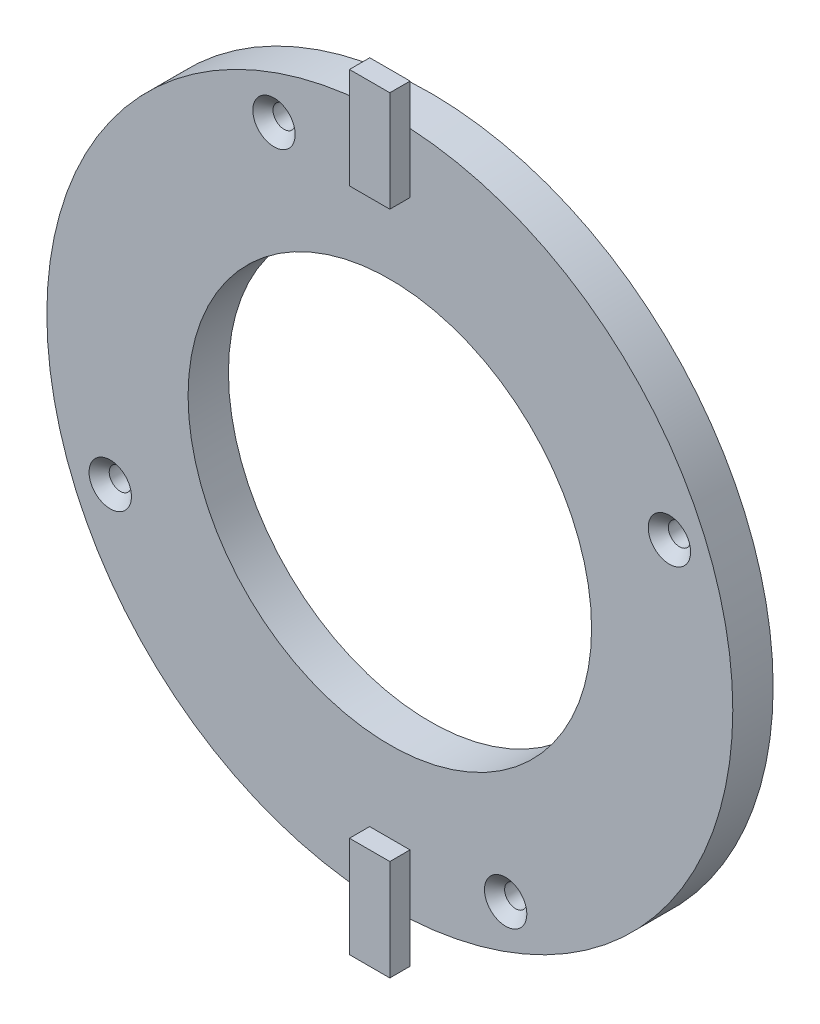
ISO-10303-21;
HEADER;
FILE_DESCRIPTION(('STEP AP214'),'2;1');
FILE_NAME('part.step','',(''),(''),'','','');
FILE_SCHEMA(('AUTOMOTIVE_DESIGN { 1 0 10303 214 1 1 1 1 }'));
ENDSEC;
DATA;
#1=APPLICATION_CONTEXT('core data for automotive mechanical design processes');
#2=APPLICATION_PROTOCOL_DEFINITION('international standard','automotive_design',2000,#1);
#3=PRODUCT_CONTEXT('',#1,'mechanical');
#4=PRODUCT('Part','Part','',(#3));
#5=PRODUCT_RELATED_PRODUCT_CATEGORY('part','',(#4));
#6=PRODUCT_DEFINITION_FORMATION('','',#4);
#7=PRODUCT_DEFINITION_CONTEXT('part definition',#1,'design');
#8=PRODUCT_DEFINITION('design','',#6,#7);
#9=PRODUCT_DEFINITION_SHAPE('','',#8);
#10=(LENGTH_UNIT() NAMED_UNIT(*) SI_UNIT(.MILLI.,.METRE.));
#11=(NAMED_UNIT(*) PLANE_ANGLE_UNIT() SI_UNIT($,.RADIAN.));
#12=(NAMED_UNIT(*) SI_UNIT($,.STERADIAN.) SOLID_ANGLE_UNIT());
#13=UNCERTAINTY_MEASURE_WITH_UNIT(LENGTH_MEASURE(1.E-05),#10,'distance_accuracy_value','');
#14=(GEOMETRIC_REPRESENTATION_CONTEXT(3) GLOBAL_UNCERTAINTY_ASSIGNED_CONTEXT((#13)) GLOBAL_UNIT_ASSIGNED_CONTEXT((#10,
#11,#12)) REPRESENTATION_CONTEXT('',''));
#15=CARTESIAN_POINT('',(0.,0.,0.));
#16=DIRECTION('',(0.,0.,1.));
#17=DIRECTION('',(1.,0.,0.));
#18=AXIS2_PLACEMENT_3D('',#15,#16,#17);
#19=CARTESIAN_POINT('',(11.4805029709527,-27.7163859753386,-0.00999999999999959));
#20=DIRECTION('',(0.,0.,1.));
#21=DIRECTION('',(1.,0.,0.));
#22=AXIS2_PLACEMENT_3D('',#19,#20,#21);
#23=CYLINDRICAL_SURFACE('',#22,1.1);
#24=CARTESIAN_POINT('',(11.4805029709527,-27.7163859753386,3.));
#25=DIRECTION('',(0.,0.,1.));
#26=DIRECTION('',(1.,0.,0.));
#27=AXIS2_PLACEMENT_3D('',#24,#25,#26);
#28=CIRCLE('',#27,1.1);
#29=CARTESIAN_POINT('',(12.5805029709527,-27.7163859753386,3.));
#30=VERTEX_POINT('',#29);
#31=EDGE_CURVE('E275',#30,#30,#28,.T.);
#32=ORIENTED_EDGE('',*,*,#31,.T.);
#33=EDGE_LOOP('',(#32));
#34=FACE_BOUND('',#33,.T.);
#35=CARTESIAN_POINT('',(11.4805029709527,-27.7163859753386,1.1));
#36=DIRECTION('',(0.,0.,-1.));
#37=DIRECTION('',(-1.,0.,0.));
#38=AXIS2_PLACEMENT_3D('',#35,#36,#37);
#39=CIRCLE('',#38,1.1);
#40=CARTESIAN_POINT('',(10.3805029709527,-27.7163859753386,1.1));
#41=VERTEX_POINT('',#40);
#42=EDGE_CURVE('E44',#41,#41,#39,.F.);
#43=ORIENTED_EDGE('',*,*,#42,.F.);
#44=EDGE_LOOP('',(#43));
#45=FACE_BOUND('',#44,.T.);
#46=ADVANCED_FACE('F41',(#34,#45),#23,.F.);
#47=CARTESIAN_POINT('',(-27.7163859753386,-11.4805029709527,-0.00999999999999959));
#48=DIRECTION('',(0.,0.,1.));
#49=DIRECTION('',(1.,0.,0.));
#50=AXIS2_PLACEMENT_3D('',#47,#48,#49);
#51=CYLINDRICAL_SURFACE('',#50,1.1);
#52=CARTESIAN_POINT('',(-27.7163859753386,-11.4805029709527,3.));
#53=DIRECTION('',(0.,0.,1.));
#54=DIRECTION('',(1.,0.,0.));
#55=AXIS2_PLACEMENT_3D('',#52,#53,#54);
#56=CIRCLE('',#55,1.1);
#57=CARTESIAN_POINT('',(-26.6163859753386,-11.4805029709527,3.));
#58=VERTEX_POINT('',#57);
#59=EDGE_CURVE('E267',#58,#58,#56,.T.);
#60=ORIENTED_EDGE('',*,*,#59,.T.);
#61=EDGE_LOOP('',(#60));
#62=FACE_BOUND('',#61,.T.);
#63=CARTESIAN_POINT('',(-27.7163859753386,-11.4805029709527,1.1));
#64=DIRECTION('',(0.,0.,-1.));
#65=DIRECTION('',(-1.,0.,0.));
#66=AXIS2_PLACEMENT_3D('',#63,#64,#65);
#67=CIRCLE('',#66,1.1);
#68=CARTESIAN_POINT('',(-28.8163859753386,-11.4805029709527,1.1));
#69=VERTEX_POINT('',#68);
#70=EDGE_CURVE('E282',#69,#69,#67,.F.);
#71=ORIENTED_EDGE('',*,*,#70,.F.);
#72=EDGE_LOOP('',(#71));
#73=FACE_BOUND('',#72,.T.);
#74=ADVANCED_FACE('F393',(#62,#73),#51,.F.);
#75=CARTESIAN_POINT('',(-11.4805029709527,27.7163859753386,-0.00999999999999959));
#76=DIRECTION('',(0.,0.,1.));
#77=DIRECTION('',(1.,0.,0.));
#78=AXIS2_PLACEMENT_3D('',#75,#76,#77);
#79=CYLINDRICAL_SURFACE('',#78,1.1);
#80=CARTESIAN_POINT('',(-11.4805029709527,27.7163859753386,3.));
#81=DIRECTION('',(0.,0.,1.));
#82=DIRECTION('',(1.,0.,0.));
#83=AXIS2_PLACEMENT_3D('',#80,#81,#82);
#84=CIRCLE('',#83,1.1);
#85=CARTESIAN_POINT('',(-10.3805029709527,27.7163859753386,3.));
#86=VERTEX_POINT('',#85);
#87=EDGE_CURVE('E261',#86,#86,#84,.T.);
#88=ORIENTED_EDGE('',*,*,#87,.T.);
#89=EDGE_LOOP('',(#88));
#90=FACE_BOUND('',#89,.T.);
#91=CARTESIAN_POINT('',(-11.4805029709527,27.7163859753386,1.1));
#92=DIRECTION('',(0.,0.,-1.));
#93=DIRECTION('',(-1.,0.,0.));
#94=AXIS2_PLACEMENT_3D('',#91,#92,#93);
#95=CIRCLE('',#94,1.1);
#96=CARTESIAN_POINT('',(-12.5805029709527,27.7163859753386,1.1));
#97=VERTEX_POINT('',#96);
#98=EDGE_CURVE('E283',#97,#97,#95,.F.);
#99=ORIENTED_EDGE('',*,*,#98,.F.);
#100=EDGE_LOOP('',(#99));
#101=FACE_BOUND('',#100,.T.);
#102=ADVANCED_FACE('F397',(#90,#101),#79,.F.);
#103=CARTESIAN_POINT('',(27.7163859753386,11.4805029709527,-0.00999999999999959));
#104=DIRECTION('',(0.,0.,1.));
#105=DIRECTION('',(1.,0.,0.));
#106=AXIS2_PLACEMENT_3D('',#103,#104,#105);
#107=CYLINDRICAL_SURFACE('',#106,1.1);
#108=CARTESIAN_POINT('',(27.7163859753386,11.4805029709527,3.));
#109=DIRECTION('',(0.,0.,1.));
#110=DIRECTION('',(1.,0.,0.));
#111=AXIS2_PLACEMENT_3D('',#108,#109,#110);
#112=CIRCLE('',#111,1.1);
#113=CARTESIAN_POINT('',(28.8163859753386,11.4805029709527,3.));
#114=VERTEX_POINT('',#113);
#115=EDGE_CURVE('E256',#114,#114,#112,.T.);
#116=ORIENTED_EDGE('',*,*,#115,.T.);
#117=EDGE_LOOP('',(#116));
#118=FACE_BOUND('',#117,.T.);
#119=CARTESIAN_POINT('',(27.7163859753386,11.4805029709527,1.1));
#120=DIRECTION('',(0.,0.,-1.));
#121=DIRECTION('',(-1.,0.,0.));
#122=AXIS2_PLACEMENT_3D('',#119,#120,#121);
#123=CIRCLE('',#122,1.1);
#124=CARTESIAN_POINT('',(26.6163859753386,11.4805029709527,1.1));
#125=VERTEX_POINT('',#124);
#126=EDGE_CURVE('E280',#125,#125,#123,.F.);
#127=ORIENTED_EDGE('',*,*,#126,.F.);
#128=EDGE_LOOP('',(#127));
#129=FACE_BOUND('',#128,.T.);
#130=ADVANCED_FACE('F433',(#118,#129),#107,.F.);
#131=CARTESIAN_POINT('',(0.,0.,4.));
#132=DIRECTION('',(0.,0.,1.));
#133=DIRECTION('',(1.,0.,0.));
#134=AXIS2_PLACEMENT_3D('',#131,#132,#133);
#135=PLANE('',#134);
#136=CARTESIAN_POINT('',(27.7163859753386,11.4805029709527,4.));
#137=DIRECTION('',(0.,0.,1.));
#138=DIRECTION('',(1.,0.,0.));
#139=AXIS2_PLACEMENT_3D('',#136,#137,#138);
#140=CIRCLE('',#139,2.1);
#141=CARTESIAN_POINT('',(29.8163859753386,11.4805029709527,4.));
#142=VERTEX_POINT('',#141);
#143=EDGE_CURVE('E264',#142,#142,#140,.T.);
#144=ORIENTED_EDGE('',*,*,#143,.F.);
#145=EDGE_LOOP('',(#144));
#146=FACE_BOUND('',#145,.T.);
#147=CARTESIAN_POINT('',(-11.4805029709527,27.7163859753386,4.));
#148=DIRECTION('',(0.,0.,1.));
#149=DIRECTION('',(1.,0.,0.));
#150=AXIS2_PLACEMENT_3D('',#147,#148,#149);
#151=CIRCLE('',#150,2.1);
#152=CARTESIAN_POINT('',(-9.38050297095269,27.7163859753386,4.));
#153=VERTEX_POINT('',#152);
#154=EDGE_CURVE('E306',#153,#153,#151,.T.);
#155=ORIENTED_EDGE('',*,*,#154,.F.);
#156=EDGE_LOOP('',(#155));
#157=FACE_BOUND('',#156,.T.);
#158=CARTESIAN_POINT('',(-27.7163859753386,-11.4805029709527,4.));
#159=DIRECTION('',(0.,0.,1.));
#160=DIRECTION('',(1.,0.,0.));
#161=AXIS2_PLACEMENT_3D('',#158,#159,#160);
#162=CIRCLE('',#161,2.1);
#163=CARTESIAN_POINT('',(-25.6163859753386,-11.4805029709527,4.));
#164=VERTEX_POINT('',#163);
#165=EDGE_CURVE('E299',#164,#164,#162,.T.);
#166=ORIENTED_EDGE('',*,*,#165,.F.);
#167=EDGE_LOOP('',(#166));
#168=FACE_BOUND('',#167,.T.);
#169=CARTESIAN_POINT('',(11.4805029709527,-27.7163859753386,4.));
#170=DIRECTION('',(0.,0.,1.));
#171=DIRECTION('',(1.,0.,0.));
#172=AXIS2_PLACEMENT_3D('',#169,#170,#171);
#173=CIRCLE('',#172,2.1);
#174=CARTESIAN_POINT('',(13.5805029709527,-27.7163859753386,4.));
#175=VERTEX_POINT('',#174);
#176=EDGE_CURVE('E291',#175,#175,#173,.T.);
#177=ORIENTED_EDGE('',*,*,#176,.F.);
#178=EDGE_LOOP('',(#177));
#179=FACE_BOUND('',#178,.T.);
#180=CARTESIAN_POINT('',(0.,0.,4.));
#181=DIRECTION('',(0.,0.,1.));
#182=DIRECTION('',(1.,0.,0.));
#183=AXIS2_PLACEMENT_3D('',#180,#181,#182);
#184=CIRCLE('',#183,20.);
#185=CARTESIAN_POINT('',(20.,0.,4.));
#186=VERTEX_POINT('',#185);
#187=EDGE_CURVE('E217',#186,#186,#184,.T.);
#188=ORIENTED_EDGE('',*,*,#187,.F.);
#189=EDGE_LOOP('',(#188));
#190=FACE_BOUND('',#189,.T.);
#191=DIRECTION('',(-1.,0.,0.));
#192=VECTOR('',#191,1.);
#193=CARTESIAN_POINT('',(0.,28.,4.));
#194=LINE('',#193,#192);
#195=CARTESIAN_POINT('',(2.,28.,4.));
#196=VERTEX_POINT('',#195);
#197=CARTESIAN_POINT('',(-2.,28.,4.));
#198=VERTEX_POINT('',#197);
#199=EDGE_CURVE('E11',#196,#198,#194,.T.);
#200=ORIENTED_EDGE('',*,*,#199,.T.);
#201=DIRECTION('',(0.,1.,0.));
#202=VECTOR('',#201,1.);
#203=CARTESIAN_POINT('',(-2.,0.,4.));
#204=LINE('',#203,#202);
#205=CARTESIAN_POINT('',(-2.,33.9411254969543,4.));
#206=VERTEX_POINT('',#205);
#207=EDGE_CURVE('E157',#198,#206,#204,.T.);
#208=ORIENTED_EDGE('',*,*,#207,.T.);
#209=CARTESIAN_POINT('',(0.,0.,4.));
#210=DIRECTION('',(0.,0.,1.));
#211=DIRECTION('',(1.,0.,0.));
#212=AXIS2_PLACEMENT_3D('',#209,#210,#211);
#213=CIRCLE('',#212,34.);
#214=CARTESIAN_POINT('',(-2.,-33.9411254969543,4.));
#215=VERTEX_POINT('',#214);
#216=EDGE_CURVE('E231',#206,#215,#213,.T.);
#217=ORIENTED_EDGE('',*,*,#216,.T.);
#218=DIRECTION('',(0.,1.,0.));
#219=VECTOR('',#218,1.);
#220=CARTESIAN_POINT('',(-2.,0.,4.));
#221=LINE('',#220,#219);
#222=CARTESIAN_POINT('',(-2.,-28.,4.));
#223=VERTEX_POINT('',#222);
#224=EDGE_CURVE('E213',#215,#223,#221,.T.);
#225=ORIENTED_EDGE('',*,*,#224,.T.);
#226=DIRECTION('',(1.,0.,0.));
#227=VECTOR('',#226,1.);
#228=CARTESIAN_POINT('',(0.,-28.,4.));
#229=LINE('',#228,#227);
#230=CARTESIAN_POINT('',(2.,-28.,4.));
#231=VERTEX_POINT('',#230);
#232=EDGE_CURVE('E246',#223,#231,#229,.T.);
#233=ORIENTED_EDGE('',*,*,#232,.T.);
#234=DIRECTION('',(0.,-1.,0.));
#235=VECTOR('',#234,1.);
#236=CARTESIAN_POINT('',(2.,0.,4.));
#237=LINE('',#236,#235);
#238=CARTESIAN_POINT('',(2.,-33.9411254969543,4.));
#239=VERTEX_POINT('',#238);
#240=EDGE_CURVE('E212',#231,#239,#237,.T.);
#241=ORIENTED_EDGE('',*,*,#240,.T.);
#242=CARTESIAN_POINT('',(2.,33.9411254969543,4.));
#243=VERTEX_POINT('',#242);
#244=EDGE_CURVE('E226',#239,#243,#213,.T.);
#245=ORIENTED_EDGE('',*,*,#244,.T.);
#246=DIRECTION('',(0.,-1.,0.));
#247=VECTOR('',#246,1.);
#248=CARTESIAN_POINT('',(2.,0.,4.));
#249=LINE('',#248,#247);
#250=EDGE_CURVE('E159',#243,#196,#249,.T.);
#251=ORIENTED_EDGE('',*,*,#250,.T.);
#252=EDGE_LOOP('',(#200,#208,#217,#225,#233,#241,#245,#251));
#253=FACE_BOUND('',#252,.T.);
#254=ADVANCED_FACE('F368',(#146,#157,#168,#179,#190,#253),#135,.T.);
#255=CARTESIAN_POINT('',(0.,0.,4.));
#256=DIRECTION('',(0.,0.,-1.));
#257=DIRECTION('',(-1.,0.,0.));
#258=AXIS2_PLACEMENT_3D('',#255,#256,#257);
#259=CYLINDRICAL_SURFACE('',#258,34.);
#260=CARTESIAN_POINT('',(0.,0.,0.));
#261=DIRECTION('',(0.,0.,1.));
#262=DIRECTION('',(1.,0.,0.));
#263=AXIS2_PLACEMENT_3D('',#260,#261,#262);
#264=CIRCLE('',#263,34.);
#265=CARTESIAN_POINT('',(34.,0.,0.));
#266=VERTEX_POINT('',#265);
#267=EDGE_CURVE('E223',#266,#266,#264,.T.);
#268=ORIENTED_EDGE('',*,*,#267,.T.);
#269=EDGE_LOOP('',(#268));
#270=FACE_BOUND('',#269,.T.);
#271=DIRECTION('',(0.,0.,-1.));
#272=VECTOR('',#271,1.);
#273=CARTESIAN_POINT('',(-2.,33.9411254969543,4.));
#274=LINE('',#273,#272);
#275=CARTESIAN_POINT('',(-2.,33.9411254969543,3.99));
#276=VERTEX_POINT('',#275);
#277=EDGE_CURVE('E51',#276,#206,#274,.F.);
#278=ORIENTED_EDGE('',*,*,#277,.F.);
#279=CARTESIAN_POINT('',(0.,0.,3.99));
#280=DIRECTION('',(0.,0.,-1.));
#281=DIRECTION('',(-1.,0.,0.));
#282=AXIS2_PLACEMENT_3D('',#279,#280,#281);
#283=CIRCLE('',#282,34.);
#284=CARTESIAN_POINT('',(2.,33.9411254969543,3.99));
#285=VERTEX_POINT('',#284);
#286=EDGE_CURVE('E249',#276,#285,#283,.T.);
#287=ORIENTED_EDGE('',*,*,#286,.T.);
#288=DIRECTION('',(0.,0.,-1.));
#289=VECTOR('',#288,1.);
#290=CARTESIAN_POINT('',(2.,33.9411254969543,4.));
#291=LINE('',#290,#289);
#292=EDGE_CURVE('E251',#243,#285,#291,.T.);
#293=ORIENTED_EDGE('',*,*,#292,.F.);
#294=ORIENTED_EDGE('',*,*,#244,.F.);
#295=DIRECTION('',(0.,0.,-1.));
#296=VECTOR('',#295,1.);
#297=CARTESIAN_POINT('',(2.,-33.9411254969543,4.));
#298=LINE('',#297,#296);
#299=CARTESIAN_POINT('',(2.,-33.9411254969543,3.99));
#300=VERTEX_POINT('',#299);
#301=EDGE_CURVE('E239',#300,#239,#298,.F.);
#302=ORIENTED_EDGE('',*,*,#301,.F.);
#303=CARTESIAN_POINT('',(0.,0.,3.99));
#304=DIRECTION('',(0.,0.,-1.));
#305=DIRECTION('',(-1.,0.,0.));
#306=AXIS2_PLACEMENT_3D('',#303,#304,#305);
#307=CIRCLE('',#306,34.);
#308=CARTESIAN_POINT('',(-2.,-33.9411254969543,3.99));
#309=VERTEX_POINT('',#308);
#310=EDGE_CURVE('E235',#300,#309,#307,.T.);
#311=ORIENTED_EDGE('',*,*,#310,.T.);
#312=DIRECTION('',(0.,0.,-1.));
#313=VECTOR('',#312,1.);
#314=CARTESIAN_POINT('',(-2.,-33.9411254969543,4.));
#315=LINE('',#314,#313);
#316=EDGE_CURVE('E243',#215,#309,#315,.T.);
#317=ORIENTED_EDGE('',*,*,#316,.F.);
#318=ORIENTED_EDGE('',*,*,#216,.F.);
#319=EDGE_LOOP('',(#278,#287,#293,#294,#302,#311,#317,#318));
#320=FACE_BOUND('',#319,.T.);
#321=ADVANCED_FACE('F43',(#270,#320),#259,.T.);
#322=CARTESIAN_POINT('',(0.,0.,0.));
#323=DIRECTION('',(0.,0.,1.));
#324=DIRECTION('',(1.,0.,0.));
#325=AXIS2_PLACEMENT_3D('',#322,#323,#324);
#326=PLANE('',#325);
#327=CARTESIAN_POINT('',(27.7163859753386,11.4805029709527,0.));
#328=DIRECTION('',(0.,0.,-1.));
#329=DIRECTION('',(-1.,0.,0.));
#330=AXIS2_PLACEMENT_3D('',#327,#328,#329);
#331=CIRCLE('',#330,1.51);
#332=CARTESIAN_POINT('',(26.2063859753386,11.4805029709527,0.));
#333=VERTEX_POINT('',#332);
#334=EDGE_CURVE('E673',#333,#333,#331,.T.);
#335=ORIENTED_EDGE('',*,*,#334,.F.);
#336=EDGE_LOOP('',(#335));
#337=FACE_BOUND('',#336,.T.);
#338=CARTESIAN_POINT('',(-11.4805029709527,27.7163859753386,0.));
#339=DIRECTION('',(0.,0.,-1.));
#340=DIRECTION('',(-1.,0.,0.));
#341=AXIS2_PLACEMENT_3D('',#338,#339,#340);
#342=CIRCLE('',#341,1.51);
#343=CARTESIAN_POINT('',(-12.9905029709527,27.7163859753386,0.));
#344=VERTEX_POINT('',#343);
#345=EDGE_CURVE('E676',#344,#344,#342,.T.);
#346=ORIENTED_EDGE('',*,*,#345,.F.);
#347=EDGE_LOOP('',(#346));
#348=FACE_BOUND('',#347,.T.);
#349=CARTESIAN_POINT('',(-27.7163859753386,-11.4805029709527,0.));
#350=DIRECTION('',(0.,0.,-1.));
#351=DIRECTION('',(-1.,0.,0.));
#352=AXIS2_PLACEMENT_3D('',#349,#350,#351);
#353=CIRCLE('',#352,1.51);
#354=CARTESIAN_POINT('',(-29.2263859753386,-11.4805029709527,0.));
#355=VERTEX_POINT('',#354);
#356=EDGE_CURVE('E490',#355,#355,#353,.T.);
#357=ORIENTED_EDGE('',*,*,#356,.F.);
#358=EDGE_LOOP('',(#357));
#359=FACE_BOUND('',#358,.T.);
#360=CARTESIAN_POINT('',(11.4805029709527,-27.7163859753386,0.));
#361=DIRECTION('',(0.,0.,-1.));
#362=DIRECTION('',(-1.,0.,0.));
#363=AXIS2_PLACEMENT_3D('',#360,#361,#362);
#364=CIRCLE('',#363,1.51);
#365=CARTESIAN_POINT('',(9.9705029709527,-27.7163859753386,0.));
#366=VERTEX_POINT('',#365);
#367=EDGE_CURVE('E477',#366,#366,#364,.T.);
#368=ORIENTED_EDGE('',*,*,#367,.F.);
#369=EDGE_LOOP('',(#368));
#370=FACE_BOUND('',#369,.T.);
#371=ORIENTED_EDGE('',*,*,#267,.F.);
#372=EDGE_LOOP('',(#371));
#373=FACE_BOUND('',#372,.T.);
#374=CARTESIAN_POINT('',(0.,0.,0.));
#375=DIRECTION('',(0.,0.,1.));
#376=DIRECTION('',(1.,0.,0.));
#377=AXIS2_PLACEMENT_3D('',#374,#375,#376);
#378=CIRCLE('',#377,20.);
#379=CARTESIAN_POINT('',(20.,0.,0.));
#380=VERTEX_POINT('',#379);
#381=EDGE_CURVE('E219',#380,#380,#378,.T.);
#382=ORIENTED_EDGE('',*,*,#381,.T.);
#383=EDGE_LOOP('',(#382));
#384=FACE_BOUND('',#383,.T.);
#385=ADVANCED_FACE('F515',(#337,#348,#359,#370,#373,#384),#326,.F.);
#386=CARTESIAN_POINT('',(0.,0.,4.));
#387=DIRECTION('',(0.,0.,-1.));
#388=DIRECTION('',(-1.,0.,0.));
#389=AXIS2_PLACEMENT_3D('',#386,#387,#388);
#390=CYLINDRICAL_SURFACE('',#389,20.);
#391=ORIENTED_EDGE('',*,*,#187,.T.);
#392=EDGE_LOOP('',(#391));
#393=FACE_BOUND('',#392,.T.);
#394=ORIENTED_EDGE('',*,*,#381,.F.);
#395=EDGE_LOOP('',(#394));
#396=FACE_BOUND('',#395,.T.);
#397=ADVANCED_FACE('F508',(#393,#396),#390,.F.);
#398=CARTESIAN_POINT('',(-2.,-38.,6.));
#399=DIRECTION('',(1.,0.,0.));
#400=DIRECTION('',(0.,0.,-1.));
#401=AXIS2_PLACEMENT_3D('',#398,#399,#400);
#402=PLANE('',#401);
#403=ORIENTED_EDGE('',*,*,#224,.F.);
#404=ORIENTED_EDGE('',*,*,#316,.T.);
#405=DIRECTION('',(0.,-1.,0.));
#406=VECTOR('',#405,1.);
#407=CARTESIAN_POINT('',(-2.,-38.,3.99));
#408=LINE('',#407,#406);
#409=CARTESIAN_POINT('',(-2.,-38.,3.99));
#410=VERTEX_POINT('',#409);
#411=EDGE_CURVE('E70',#309,#410,#408,.T.);
#412=ORIENTED_EDGE('',*,*,#411,.T.);
#413=DIRECTION('',(0.,0.,-1.));
#414=VECTOR('',#413,1.);
#415=CARTESIAN_POINT('',(-2.,-38.,6.));
#416=LINE('',#415,#414);
#417=CARTESIAN_POINT('',(-2.,-38.,6.));
#418=VERTEX_POINT('',#417);
#419=EDGE_CURVE('E210',#418,#410,#416,.T.);
#420=ORIENTED_EDGE('',*,*,#419,.F.);
#421=DIRECTION('',(0.,-1.,0.));
#422=VECTOR('',#421,1.);
#423=CARTESIAN_POINT('',(-2.,-38.,6.));
#424=LINE('',#423,#422);
#425=CARTESIAN_POINT('',(-2.,-28.,6.));
#426=VERTEX_POINT('',#425);
#427=EDGE_CURVE('E173',#426,#418,#424,.T.);
#428=ORIENTED_EDGE('',*,*,#427,.F.);
#429=DIRECTION('',(0.,0.,-1.));
#430=VECTOR('',#429,1.);
#431=CARTESIAN_POINT('',(-2.,-28.,6.));
#432=LINE('',#431,#430);
#433=EDGE_CURVE('E190',#426,#223,#432,.T.);
#434=ORIENTED_EDGE('',*,*,#433,.T.);
#435=EDGE_LOOP('',(#403,#404,#412,#420,#428,#434));
#436=FACE_BOUND('',#435,.T.);
#437=ADVANCED_FACE('F369',(#436),#402,.F.);
#438=CARTESIAN_POINT('',(-2.,-38.,6.));
#439=DIRECTION('',(0.,1.,0.));
#440=DIRECTION('',(0.,0.,1.));
#441=AXIS2_PLACEMENT_3D('',#438,#439,#440);
#442=PLANE('',#441);
#443=DIRECTION('',(1.,0.,0.));
#444=VECTOR('',#443,1.);
#445=CARTESIAN_POINT('',(-2.,-38.,3.99));
#446=LINE('',#445,#444);
#447=CARTESIAN_POINT('',(2.,-38.,3.99));
#448=VERTEX_POINT('',#447);
#449=EDGE_CURVE('E188',#410,#448,#446,.T.);
#450=ORIENTED_EDGE('',*,*,#449,.T.);
#451=DIRECTION('',(0.,0.,-1.));
#452=VECTOR('',#451,1.);
#453=CARTESIAN_POINT('',(2.,-38.,6.));
#454=LINE('',#453,#452);
#455=CARTESIAN_POINT('',(2.,-38.,6.));
#456=VERTEX_POINT('',#455);
#457=EDGE_CURVE('E202',#456,#448,#454,.T.);
#458=ORIENTED_EDGE('',*,*,#457,.F.);
#459=DIRECTION('',(1.,0.,0.));
#460=VECTOR('',#459,1.);
#461=CARTESIAN_POINT('',(-2.,-38.,6.));
#462=LINE('',#461,#460);
#463=EDGE_CURVE('E180',#418,#456,#462,.T.);
#464=ORIENTED_EDGE('',*,*,#463,.F.);
#465=ORIENTED_EDGE('',*,*,#419,.T.);
#466=EDGE_LOOP('',(#450,#458,#464,#465));
#467=FACE_BOUND('',#466,.T.);
#468=ADVANCED_FACE('F527',(#467),#442,.F.);
#469=CARTESIAN_POINT('',(2.,-38.,6.));
#470=DIRECTION('',(-1.,0.,0.));
#471=DIRECTION('',(0.,0.,1.));
#472=AXIS2_PLACEMENT_3D('',#469,#470,#471);
#473=PLANE('',#472);
#474=ORIENTED_EDGE('',*,*,#240,.F.);
#475=DIRECTION('',(0.,0.,-1.));
#476=VECTOR('',#475,1.);
#477=CARTESIAN_POINT('',(2.,-28.,6.));
#478=LINE('',#477,#476);
#479=CARTESIAN_POINT('',(2.,-28.,6.));
#480=VERTEX_POINT('',#479);
#481=EDGE_CURVE('E199',#480,#231,#478,.T.);
#482=ORIENTED_EDGE('',*,*,#481,.F.);
#483=DIRECTION('',(0.,1.,0.));
#484=VECTOR('',#483,1.);
#485=CARTESIAN_POINT('',(2.,-38.,6.));
#486=LINE('',#485,#484);
#487=EDGE_CURVE('E181',#456,#480,#486,.T.);
#488=ORIENTED_EDGE('',*,*,#487,.F.);
#489=ORIENTED_EDGE('',*,*,#457,.T.);
#490=DIRECTION('',(0.,1.,0.));
#491=VECTOR('',#490,1.);
#492=CARTESIAN_POINT('',(2.,-38.,3.99));
#493=LINE('',#492,#491);
#494=EDGE_CURVE('E178',#448,#300,#493,.T.);
#495=ORIENTED_EDGE('',*,*,#494,.T.);
#496=ORIENTED_EDGE('',*,*,#301,.T.);
#497=EDGE_LOOP('',(#474,#482,#488,#489,#495,#496));
#498=FACE_BOUND('',#497,.T.);
#499=ADVANCED_FACE('F532',(#498),#473,.F.);
#500=CARTESIAN_POINT('',(-2.,-28.,6.));
#501=DIRECTION('',(0.,-1.,0.));
#502=DIRECTION('',(0.,0.,-1.));
#503=AXIS2_PLACEMENT_3D('',#500,#501,#502);
#504=PLANE('',#503);
#505=ORIENTED_EDGE('',*,*,#232,.F.);
#506=ORIENTED_EDGE('',*,*,#433,.F.);
#507=DIRECTION('',(-1.,0.,0.));
#508=VECTOR('',#507,1.);
#509=CARTESIAN_POINT('',(-2.,-28.,6.));
#510=LINE('',#509,#508);
#511=EDGE_CURVE('E183',#480,#426,#510,.T.);
#512=ORIENTED_EDGE('',*,*,#511,.F.);
#513=ORIENTED_EDGE('',*,*,#481,.T.);
#514=EDGE_LOOP('',(#505,#506,#512,#513));
#515=FACE_BOUND('',#514,.T.);
#516=ADVANCED_FACE('F376',(#515),#504,.F.);
#517=CARTESIAN_POINT('',(0.,0.,6.));
#518=DIRECTION('',(0.,0.,-1.));
#519=DIRECTION('',(-1.,0.,0.));
#520=AXIS2_PLACEMENT_3D('',#517,#518,#519);
#521=PLANE('',#520);
#522=ORIENTED_EDGE('',*,*,#427,.T.);
#523=ORIENTED_EDGE('',*,*,#463,.T.);
#524=ORIENTED_EDGE('',*,*,#487,.T.);
#525=ORIENTED_EDGE('',*,*,#511,.T.);
#526=EDGE_LOOP('',(#522,#523,#524,#525));
#527=FACE_BOUND('',#526,.T.);
#528=ADVANCED_FACE('F540',(#527),#521,.F.);
#529=CARTESIAN_POINT('',(0.,0.,3.99));
#530=DIRECTION('',(0.,0.,-1.));
#531=DIRECTION('',(-1.,0.,0.));
#532=AXIS2_PLACEMENT_3D('',#529,#530,#531);
#533=PLANE('',#532);
#534=ORIENTED_EDGE('',*,*,#310,.F.);
#535=ORIENTED_EDGE('',*,*,#494,.F.);
#536=ORIENTED_EDGE('',*,*,#449,.F.);
#537=ORIENTED_EDGE('',*,*,#411,.F.);
#538=EDGE_LOOP('',(#534,#535,#536,#537));
#539=FACE_BOUND('',#538,.T.);
#540=ADVANCED_FACE('F539',(#539),#533,.T.);
#541=CARTESIAN_POINT('',(-2.,28.,6.));
#542=DIRECTION('',(1.,0.,0.));
#543=DIRECTION('',(0.,0.,-1.));
#544=AXIS2_PLACEMENT_3D('',#541,#542,#543);
#545=PLANE('',#544);
#546=ORIENTED_EDGE('',*,*,#207,.F.);
#547=DIRECTION('',(0.,0.,-1.));
#548=VECTOR('',#547,1.);
#549=CARTESIAN_POINT('',(-2.,28.,6.));
#550=LINE('',#549,#548);
#551=CARTESIAN_POINT('',(-2.,28.,6.));
#552=VERTEX_POINT('',#551);
#553=EDGE_CURVE('E140',#552,#198,#550,.T.);
#554=ORIENTED_EDGE('',*,*,#553,.F.);
#555=DIRECTION('',(0.,-1.,0.));
#556=VECTOR('',#555,1.);
#557=CARTESIAN_POINT('',(-2.,28.,6.));
#558=LINE('',#557,#556);
#559=CARTESIAN_POINT('',(-2.,38.,6.));
#560=VERTEX_POINT('',#559);
#561=EDGE_CURVE('E144',#560,#552,#558,.T.);
#562=ORIENTED_EDGE('',*,*,#561,.F.);
#563=DIRECTION('',(0.,0.,-1.));
#564=VECTOR('',#563,1.);
#565=CARTESIAN_POINT('',(-2.,38.,6.));
#566=LINE('',#565,#564);
#567=CARTESIAN_POINT('',(-2.,38.,3.99));
#568=VERTEX_POINT('',#567);
#569=EDGE_CURVE('E313',#560,#568,#566,.T.);
#570=ORIENTED_EDGE('',*,*,#569,.T.);
#571=DIRECTION('',(0.,-1.,0.));
#572=VECTOR('',#571,1.);
#573=CARTESIAN_POINT('',(-2.,28.,3.99));
#574=LINE('',#573,#572);
#575=EDGE_CURVE('E277',#568,#276,#574,.T.);
#576=ORIENTED_EDGE('',*,*,#575,.T.);
#577=ORIENTED_EDGE('',*,*,#277,.T.);
#578=EDGE_LOOP('',(#546,#554,#562,#570,#576,#577));
#579=FACE_BOUND('',#578,.T.);
#580=ADVANCED_FACE('F156',(#579),#545,.F.);
#581=CARTESIAN_POINT('',(-2.,28.,6.));
#582=DIRECTION('',(0.,1.,0.));
#583=DIRECTION('',(0.,0.,1.));
#584=AXIS2_PLACEMENT_3D('',#581,#582,#583);
#585=PLANE('',#584);
#586=ORIENTED_EDGE('',*,*,#199,.F.);
#587=DIRECTION('',(0.,0.,-1.));
#588=VECTOR('',#587,1.);
#589=CARTESIAN_POINT('',(2.,28.,6.));
#590=LINE('',#589,#588);
#591=CARTESIAN_POINT('',(2.,28.,6.));
#592=VERTEX_POINT('',#591);
#593=EDGE_CURVE('E138',#592,#196,#590,.T.);
#594=ORIENTED_EDGE('',*,*,#593,.F.);
#595=DIRECTION('',(1.,0.,0.));
#596=VECTOR('',#595,1.);
#597=CARTESIAN_POINT('',(-2.,28.,6.));
#598=LINE('',#597,#596);
#599=EDGE_CURVE('E131',#552,#592,#598,.T.);
#600=ORIENTED_EDGE('',*,*,#599,.F.);
#601=ORIENTED_EDGE('',*,*,#553,.T.);
#602=EDGE_LOOP('',(#586,#594,#600,#601));
#603=FACE_BOUND('',#602,.T.);
#604=ADVANCED_FACE('F132',(#603),#585,.F.);
#605=CARTESIAN_POINT('',(2.,28.,6.));
#606=DIRECTION('',(-1.,0.,0.));
#607=DIRECTION('',(0.,0.,1.));
#608=AXIS2_PLACEMENT_3D('',#605,#606,#607);
#609=PLANE('',#608);
#610=ORIENTED_EDGE('',*,*,#250,.F.);
#611=ORIENTED_EDGE('',*,*,#292,.T.);
#612=DIRECTION('',(0.,1.,0.));
#613=VECTOR('',#612,1.);
#614=CARTESIAN_POINT('',(2.,28.,3.99));
#615=LINE('',#614,#613);
#616=CARTESIAN_POINT('',(2.,38.,3.99));
#617=VERTEX_POINT('',#616);
#618=EDGE_CURVE('E56',#285,#617,#615,.T.);
#619=ORIENTED_EDGE('',*,*,#618,.T.);
#620=DIRECTION('',(0.,0.,-1.));
#621=VECTOR('',#620,1.);
#622=CARTESIAN_POINT('',(2.,38.,6.));
#623=LINE('',#622,#621);
#624=CARTESIAN_POINT('',(2.,38.,6.));
#625=VERTEX_POINT('',#624);
#626=EDGE_CURVE('E170',#625,#617,#623,.T.);
#627=ORIENTED_EDGE('',*,*,#626,.F.);
#628=DIRECTION('',(0.,1.,0.));
#629=VECTOR('',#628,1.);
#630=CARTESIAN_POINT('',(2.,28.,6.));
#631=LINE('',#630,#629);
#632=EDGE_CURVE('E141',#592,#625,#631,.T.);
#633=ORIENTED_EDGE('',*,*,#632,.F.);
#634=ORIENTED_EDGE('',*,*,#593,.T.);
#635=EDGE_LOOP('',(#610,#611,#619,#627,#633,#634));
#636=FACE_BOUND('',#635,.T.);
#637=ADVANCED_FACE('F382',(#636),#609,.F.);
#638=CARTESIAN_POINT('',(-2.,38.,6.));
#639=DIRECTION('',(0.,-1.,0.));
#640=DIRECTION('',(0.,0.,-1.));
#641=AXIS2_PLACEMENT_3D('',#638,#639,#640);
#642=PLANE('',#641);
#643=DIRECTION('',(-1.,0.,0.));
#644=VECTOR('',#643,1.);
#645=CARTESIAN_POINT('',(-2.,38.,3.99));
#646=LINE('',#645,#644);
#647=EDGE_CURVE('E154',#617,#568,#646,.T.);
#648=ORIENTED_EDGE('',*,*,#647,.T.);
#649=ORIENTED_EDGE('',*,*,#569,.F.);
#650=DIRECTION('',(-1.,0.,0.));
#651=VECTOR('',#650,1.);
#652=CARTESIAN_POINT('',(-2.,38.,6.));
#653=LINE('',#652,#651);
#654=EDGE_CURVE('E146',#625,#560,#653,.T.);
#655=ORIENTED_EDGE('',*,*,#654,.F.);
#656=ORIENTED_EDGE('',*,*,#626,.T.);
#657=EDGE_LOOP('',(#648,#649,#655,#656));
#658=FACE_BOUND('',#657,.T.);
#659=ADVANCED_FACE('F326',(#658),#642,.F.);
#660=CARTESIAN_POINT('',(0.,0.,6.));
#661=DIRECTION('',(0.,0.,-1.));
#662=DIRECTION('',(-1.,0.,0.));
#663=AXIS2_PLACEMENT_3D('',#660,#661,#662);
#664=PLANE('',#663);
#665=ORIENTED_EDGE('',*,*,#561,.T.);
#666=ORIENTED_EDGE('',*,*,#599,.T.);
#667=ORIENTED_EDGE('',*,*,#632,.T.);
#668=ORIENTED_EDGE('',*,*,#654,.T.);
#669=EDGE_LOOP('',(#665,#666,#667,#668));
#670=FACE_BOUND('',#669,.T.);
#671=ADVANCED_FACE('F150',(#670),#664,.F.);
#672=CARTESIAN_POINT('',(0.,0.,3.99));
#673=DIRECTION('',(0.,0.,-1.));
#674=DIRECTION('',(-1.,0.,0.));
#675=AXIS2_PLACEMENT_3D('',#672,#673,#674);
#676=PLANE('',#675);
#677=ORIENTED_EDGE('',*,*,#286,.F.);
#678=ORIENTED_EDGE('',*,*,#575,.F.);
#679=ORIENTED_EDGE('',*,*,#647,.F.);
#680=ORIENTED_EDGE('',*,*,#618,.F.);
#681=EDGE_LOOP('',(#677,#678,#679,#680));
#682=FACE_BOUND('',#681,.T.);
#683=ADVANCED_FACE('F331',(#682),#676,.T.);
#684=CARTESIAN_POINT('',(27.7163859753386,11.4805029709527,4.));
#685=DIRECTION('',(0.,0.,1.));
#686=DIRECTION('',(1.,0.,0.));
#687=AXIS2_PLACEMENT_3D('',#684,#685,#686);
#688=CONICAL_SURFACE('',#687,2.1,0.785398163397448);
#689=ORIENTED_EDGE('',*,*,#143,.T.);
#690=EDGE_LOOP('',(#689));
#691=FACE_BOUND('',#690,.T.);
#692=ORIENTED_EDGE('',*,*,#115,.F.);
#693=EDGE_LOOP('',(#692));
#694=FACE_BOUND('',#693,.T.);
#695=ADVANCED_FACE('F410',(#691,#694),#688,.F.);
#696=CARTESIAN_POINT('',(-11.4805029709527,27.7163859753386,4.));
#697=DIRECTION('',(0.,0.,1.));
#698=DIRECTION('',(1.,0.,0.));
#699=AXIS2_PLACEMENT_3D('',#696,#697,#698);
#700=CONICAL_SURFACE('',#699,2.1,0.785398163397448);
#701=ORIENTED_EDGE('',*,*,#154,.T.);
#702=EDGE_LOOP('',(#701));
#703=FACE_BOUND('',#702,.T.);
#704=ORIENTED_EDGE('',*,*,#87,.F.);
#705=EDGE_LOOP('',(#704));
#706=FACE_BOUND('',#705,.T.);
#707=ADVANCED_FACE('F415',(#703,#706),#700,.F.);
#708=CARTESIAN_POINT('',(-27.7163859753386,-11.4805029709527,4.));
#709=DIRECTION('',(0.,0.,1.));
#710=DIRECTION('',(1.,0.,0.));
#711=AXIS2_PLACEMENT_3D('',#708,#709,#710);
#712=CONICAL_SURFACE('',#711,2.1,0.785398163397448);
#713=ORIENTED_EDGE('',*,*,#165,.T.);
#714=EDGE_LOOP('',(#713));
#715=FACE_BOUND('',#714,.T.);
#716=ORIENTED_EDGE('',*,*,#59,.F.);
#717=EDGE_LOOP('',(#716));
#718=FACE_BOUND('',#717,.T.);
#719=ADVANCED_FACE('F417',(#715,#718),#712,.F.);
#720=CARTESIAN_POINT('',(11.4805029709527,-27.7163859753386,4.));
#721=DIRECTION('',(0.,0.,1.));
#722=DIRECTION('',(1.,0.,0.));
#723=AXIS2_PLACEMENT_3D('',#720,#721,#722);
#724=CONICAL_SURFACE('',#723,2.1,0.785398163397448);
#725=ORIENTED_EDGE('',*,*,#176,.T.);
#726=EDGE_LOOP('',(#725));
#727=FACE_BOUND('',#726,.T.);
#728=ORIENTED_EDGE('',*,*,#31,.F.);
#729=EDGE_LOOP('',(#728));
#730=FACE_BOUND('',#729,.T.);
#731=ADVANCED_FACE('F429',(#727,#730),#724,.F.);
#732=CARTESIAN_POINT('',(27.7163859753386,11.4805029709527,1.1));
#733=DIRECTION('',(0.,0.,-1.));
#734=DIRECTION('',(-1.,0.,0.));
#735=AXIS2_PLACEMENT_3D('',#732,#733,#734);
#736=PLANE('',#735);
#737=CARTESIAN_POINT('',(27.7163859753386,11.4805029709527,1.1));
#738=DIRECTION('',(0.,0.,-1.));
#739=DIRECTION('',(-1.,0.,0.));
#740=AXIS2_PLACEMENT_3D('',#737,#738,#739);
#741=CIRCLE('',#740,1.51);
#742=CARTESIAN_POINT('',(26.2063859753386,11.4805029709527,1.1));
#743=VERTEX_POINT('',#742);
#744=EDGE_CURVE('E285',#743,#743,#741,.T.);
#745=ORIENTED_EDGE('',*,*,#744,.T.);
#746=EDGE_LOOP('',(#745));
#747=FACE_BOUND('',#746,.T.);
#748=ORIENTED_EDGE('',*,*,#126,.T.);
#749=EDGE_LOOP('',(#748));
#750=FACE_BOUND('',#749,.T.);
#751=ADVANCED_FACE('F435',(#747,#750),#736,.T.);
#752=CARTESIAN_POINT('',(27.7163859753386,11.4805029709527,1.1));
#753=DIRECTION('',(0.,0.,-1.));
#754=DIRECTION('',(-1.,0.,0.));
#755=AXIS2_PLACEMENT_3D('',#752,#753,#754);
#756=CYLINDRICAL_SURFACE('',#755,1.51);
#757=ORIENTED_EDGE('',*,*,#744,.F.);
#758=EDGE_LOOP('',(#757));
#759=FACE_BOUND('',#758,.T.);
#760=ORIENTED_EDGE('',*,*,#334,.T.);
#761=EDGE_LOOP('',(#760));
#762=FACE_BOUND('',#761,.T.);
#763=ADVANCED_FACE('F450',(#759,#762),#756,.F.);
#764=CARTESIAN_POINT('',(-11.4805029709527,27.7163859753386,1.1));
#765=DIRECTION('',(0.,0.,-1.));
#766=DIRECTION('',(-1.,0.,0.));
#767=AXIS2_PLACEMENT_3D('',#764,#765,#766);
#768=PLANE('',#767);
#769=CARTESIAN_POINT('',(-11.4805029709527,27.7163859753386,1.1));
#770=DIRECTION('',(0.,0.,-1.));
#771=DIRECTION('',(-1.,0.,0.));
#772=AXIS2_PLACEMENT_3D('',#769,#770,#771);
#773=CIRCLE('',#772,1.51);
#774=CARTESIAN_POINT('',(-12.9905029709527,27.7163859753386,1.1));
#775=VERTEX_POINT('',#774);
#776=EDGE_CURVE('E682',#775,#775,#773,.T.);
#777=ORIENTED_EDGE('',*,*,#776,.T.);
#778=EDGE_LOOP('',(#777));
#779=FACE_BOUND('',#778,.T.);
#780=ORIENTED_EDGE('',*,*,#98,.T.);
#781=EDGE_LOOP('',(#780));
#782=FACE_BOUND('',#781,.T.);
#783=ADVANCED_FACE('F443',(#779,#782),#768,.T.);
#784=CARTESIAN_POINT('',(-11.4805029709527,27.7163859753386,1.1));
#785=DIRECTION('',(0.,0.,-1.));
#786=DIRECTION('',(-1.,0.,0.));
#787=AXIS2_PLACEMENT_3D('',#784,#785,#786);
#788=CYLINDRICAL_SURFACE('',#787,1.51);
#789=ORIENTED_EDGE('',*,*,#776,.F.);
#790=EDGE_LOOP('',(#789));
#791=FACE_BOUND('',#790,.T.);
#792=ORIENTED_EDGE('',*,*,#345,.T.);
#793=EDGE_LOOP('',(#792));
#794=FACE_BOUND('',#793,.T.);
#795=ADVANCED_FACE('F447',(#791,#794),#788,.F.);
#796=CARTESIAN_POINT('',(-27.7163859753386,-11.4805029709527,1.1));
#797=DIRECTION('',(0.,0.,-1.));
#798=DIRECTION('',(-1.,0.,0.));
#799=AXIS2_PLACEMENT_3D('',#796,#797,#798);
#800=PLANE('',#799);
#801=CARTESIAN_POINT('',(-27.7163859753386,-11.4805029709527,1.1));
#802=DIRECTION('',(0.,0.,-1.));
#803=DIRECTION('',(-1.,0.,0.));
#804=AXIS2_PLACEMENT_3D('',#801,#802,#803);
#805=CIRCLE('',#804,1.51);
#806=CARTESIAN_POINT('',(-29.2263859753386,-11.4805029709527,1.1));
#807=VERTEX_POINT('',#806);
#808=EDGE_CURVE('E482',#807,#807,#805,.T.);
#809=ORIENTED_EDGE('',*,*,#808,.T.);
#810=EDGE_LOOP('',(#809));
#811=FACE_BOUND('',#810,.T.);
#812=ORIENTED_EDGE('',*,*,#70,.T.);
#813=EDGE_LOOP('',(#812));
#814=FACE_BOUND('',#813,.T.);
#815=ADVANCED_FACE('F451',(#811,#814),#800,.T.);
#816=CARTESIAN_POINT('',(-27.7163859753386,-11.4805029709527,1.1));
#817=DIRECTION('',(0.,0.,-1.));
#818=DIRECTION('',(-1.,0.,0.));
#819=AXIS2_PLACEMENT_3D('',#816,#817,#818);
#820=CYLINDRICAL_SURFACE('',#819,1.51);
#821=ORIENTED_EDGE('',*,*,#808,.F.);
#822=EDGE_LOOP('',(#821));
#823=FACE_BOUND('',#822,.T.);
#824=ORIENTED_EDGE('',*,*,#356,.T.);
#825=EDGE_LOOP('',(#824));
#826=FACE_BOUND('',#825,.T.);
#827=ADVANCED_FACE('F461',(#823,#826),#820,.F.);
#828=CARTESIAN_POINT('',(11.4805029709527,-27.7163859753386,1.1));
#829=DIRECTION('',(0.,0.,-1.));
#830=DIRECTION('',(-1.,0.,0.));
#831=AXIS2_PLACEMENT_3D('',#828,#829,#830);
#832=PLANE('',#831);
#833=CARTESIAN_POINT('',(11.4805029709527,-27.7163859753386,1.1));
#834=DIRECTION('',(0.,0.,-1.));
#835=DIRECTION('',(-1.,0.,0.));
#836=AXIS2_PLACEMENT_3D('',#833,#834,#835);
#837=CIRCLE('',#836,1.51);
#838=CARTESIAN_POINT('',(9.9705029709527,-27.7163859753386,1.1));
#839=VERTEX_POINT('',#838);
#840=EDGE_CURVE('E480',#839,#839,#837,.T.);
#841=ORIENTED_EDGE('',*,*,#840,.T.);
#842=EDGE_LOOP('',(#841));
#843=FACE_BOUND('',#842,.T.);
#844=ORIENTED_EDGE('',*,*,#42,.T.);
#845=EDGE_LOOP('',(#844));
#846=FACE_BOUND('',#845,.T.);
#847=ADVANCED_FACE('F425',(#843,#846),#832,.T.);
#848=CARTESIAN_POINT('',(11.4805029709527,-27.7163859753386,1.1));
#849=DIRECTION('',(0.,0.,-1.));
#850=DIRECTION('',(-1.,0.,0.));
#851=AXIS2_PLACEMENT_3D('',#848,#849,#850);
#852=CYLINDRICAL_SURFACE('',#851,1.51);
#853=ORIENTED_EDGE('',*,*,#840,.F.);
#854=EDGE_LOOP('',(#853));
#855=FACE_BOUND('',#854,.T.);
#856=ORIENTED_EDGE('',*,*,#367,.T.);
#857=EDGE_LOOP('',(#856));
#858=FACE_BOUND('',#857,.T.);
#859=ADVANCED_FACE('F470',(#855,#858),#852,.F.);
#860=CLOSED_SHELL('',(#46,#74,#102,#130,#254,#321,#385,#397,#437,#468,#499,#516,#528,#540,#580,
#604,#637,#659,#671,#683,#695,#707,#719,#731,#751,#763,#783,#795,#815,#827,#847,#859));
#861=MANIFOLD_SOLID_BREP('B2',#860);
#862=ADVANCED_BREP_SHAPE_REPRESENTATION('',(#18,#861),#14);
#863=SHAPE_DEFINITION_REPRESENTATION(#9,#862);
ENDSEC;
END-ISO-10303-21;
